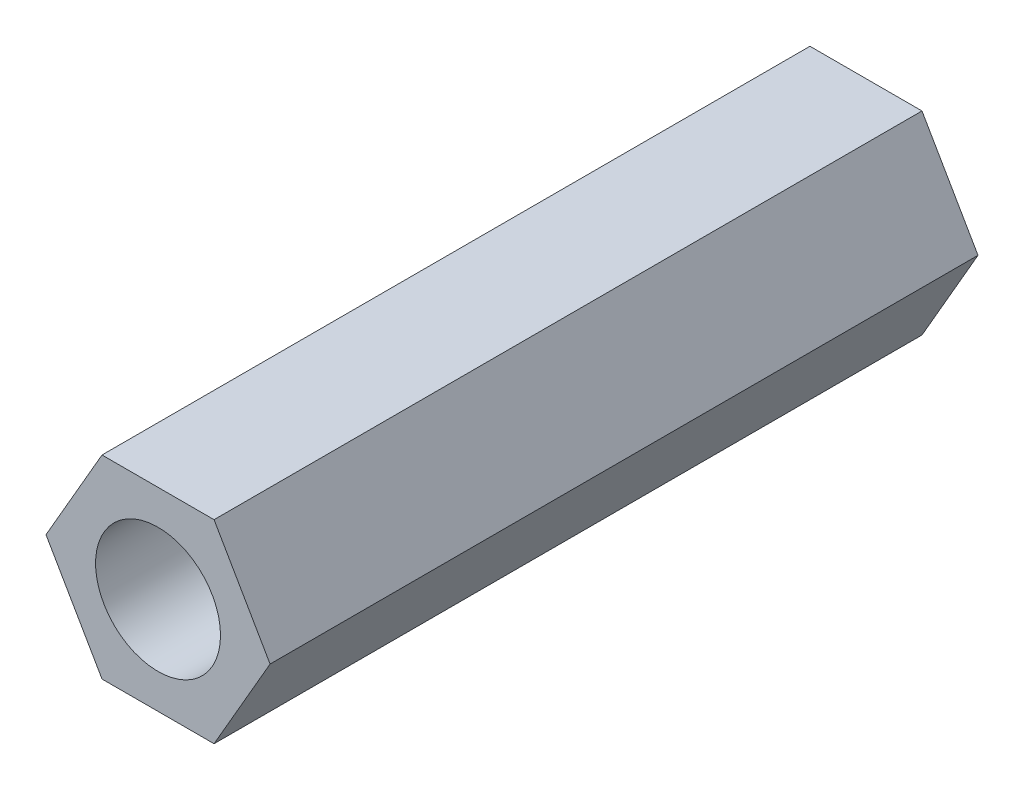
ISO-10303-21;
HEADER;
FILE_DESCRIPTION(('STEP AP214'),'2;1');
FILE_NAME('part.step','',(''),(''),'','','');
FILE_SCHEMA(('AUTOMOTIVE_DESIGN { 1 0 10303 214 1 1 1 1 }'));
ENDSEC;
DATA;
#1=APPLICATION_CONTEXT('core data for automotive mechanical design processes');
#2=APPLICATION_PROTOCOL_DEFINITION('international standard','automotive_design',2000,#1);
#3=PRODUCT_CONTEXT('',#1,'mechanical');
#4=PRODUCT('Part','Part','',(#3));
#5=PRODUCT_RELATED_PRODUCT_CATEGORY('part','',(#4));
#6=PRODUCT_DEFINITION_FORMATION('','',#4);
#7=PRODUCT_DEFINITION_CONTEXT('part definition',#1,'design');
#8=PRODUCT_DEFINITION('design','',#6,#7);
#9=PRODUCT_DEFINITION_SHAPE('','',#8);
#10=(LENGTH_UNIT() NAMED_UNIT(*) SI_UNIT(.MILLI.,.METRE.));
#11=(NAMED_UNIT(*) PLANE_ANGLE_UNIT() SI_UNIT($,.RADIAN.));
#12=(NAMED_UNIT(*) SI_UNIT($,.STERADIAN.) SOLID_ANGLE_UNIT());
#13=UNCERTAINTY_MEASURE_WITH_UNIT(LENGTH_MEASURE(1.E-05),#10,'distance_accuracy_value','');
#14=(GEOMETRIC_REPRESENTATION_CONTEXT(3) GLOBAL_UNCERTAINTY_ASSIGNED_CONTEXT((#13)) GLOBAL_UNIT_ASSIGNED_CONTEXT((#10,
#11,#12)) REPRESENTATION_CONTEXT('',''));
#15=CARTESIAN_POINT('',(0.,0.,0.));
#16=DIRECTION('',(0.,0.,1.));
#17=DIRECTION('',(1.,0.,0.));
#18=AXIS2_PLACEMENT_3D('',#15,#16,#17);
#19=CARTESIAN_POINT('',(1.34522612721186,-2.32999999999999,17.));
#20=DIRECTION('',(-0.866025403784442,0.499999999999995,0.));
#21=DIRECTION('',(-0.499999999999995,-0.866025403784441,0.));
#22=AXIS2_PLACEMENT_3D('',#19,#20,#21);
#23=PLANE('',#22);
#24=DIRECTION('',(0.499999999999995,0.866025403784441,0.));
#25=VECTOR('',#24,1.);
#26=CARTESIAN_POINT('',(1.34522612721186,-2.32999999999999,0.));
#27=LINE('',#26,#25);
#28=CARTESIAN_POINT('',(1.34522612721186,-2.32999999999999,0.));
#29=VERTEX_POINT('',#28);
#30=CARTESIAN_POINT('',(2.69045225442366,0.,0.));
#31=VERTEX_POINT('',#30);
#32=EDGE_CURVE('E117',#29,#31,#27,.T.);
#33=ORIENTED_EDGE('',*,*,#32,.T.);
#34=DIRECTION('',(0.,0.,-1.));
#35=VECTOR('',#34,1.);
#36=CARTESIAN_POINT('',(2.69045225442366,0.,17.));
#37=LINE('',#36,#35);
#38=CARTESIAN_POINT('',(2.69045225442366,0.,17.));
#39=VERTEX_POINT('',#38);
#40=EDGE_CURVE('E11',#39,#31,#37,.T.);
#41=ORIENTED_EDGE('',*,*,#40,.F.);
#42=DIRECTION('',(0.499999999999995,0.866025403784441,0.));
#43=VECTOR('',#42,1.);
#44=CARTESIAN_POINT('',(1.34522612721186,-2.32999999999999,17.));
#45=LINE('',#44,#43);
#46=CARTESIAN_POINT('',(1.34522612721186,-2.32999999999999,17.));
#47=VERTEX_POINT('',#46);
#48=EDGE_CURVE('E128',#47,#39,#45,.T.);
#49=ORIENTED_EDGE('',*,*,#48,.F.);
#50=DIRECTION('',(0.,0.,-1.));
#51=VECTOR('',#50,1.);
#52=CARTESIAN_POINT('',(1.34522612721186,-2.32999999999999,17.));
#53=LINE('',#52,#51);
#54=EDGE_CURVE('E113',#47,#29,#53,.T.);
#55=ORIENTED_EDGE('',*,*,#54,.T.);
#56=EDGE_LOOP('',(#33,#41,#49,#55));
#57=FACE_BOUND('',#56,.T.);
#58=ADVANCED_FACE('F33',(#57),#23,.F.);
#59=CARTESIAN_POINT('',(2.69045225442366,0.,17.));
#60=DIRECTION('',(-0.866025403784438,-0.500000000000001,0.));
#61=DIRECTION('',(0.500000000000001,-0.866025403784438,0.));
#62=AXIS2_PLACEMENT_3D('',#59,#60,#61);
#63=PLANE('',#62);
#64=DIRECTION('',(-0.500000000000001,0.866025403784438,0.));
#65=VECTOR('',#64,1.);
#66=CARTESIAN_POINT('',(2.69045225442366,0.,0.));
#67=LINE('',#66,#65);
#68=CARTESIAN_POINT('',(1.34522612721182,2.33000000000001,0.));
#69=VERTEX_POINT('',#68);
#70=EDGE_CURVE('E120',#31,#69,#67,.T.);
#71=ORIENTED_EDGE('',*,*,#70,.T.);
#72=DIRECTION('',(0.,0.,-1.));
#73=VECTOR('',#72,1.);
#74=CARTESIAN_POINT('',(1.34522612721182,2.33000000000001,17.));
#75=LINE('',#74,#73);
#76=CARTESIAN_POINT('',(1.34522612721182,2.33000000000001,17.));
#77=VERTEX_POINT('',#76);
#78=EDGE_CURVE('E41',#77,#69,#75,.T.);
#79=ORIENTED_EDGE('',*,*,#78,.F.);
#80=DIRECTION('',(-0.500000000000001,0.866025403784438,0.));
#81=VECTOR('',#80,1.);
#82=CARTESIAN_POINT('',(2.69045225442366,0.,17.));
#83=LINE('',#82,#81);
#84=EDGE_CURVE('E86',#39,#77,#83,.T.);
#85=ORIENTED_EDGE('',*,*,#84,.F.);
#86=ORIENTED_EDGE('',*,*,#40,.T.);
#87=EDGE_LOOP('',(#71,#79,#85,#86));
#88=FACE_BOUND('',#87,.T.);
#89=ADVANCED_FACE('F153',(#88),#63,.F.);
#90=CARTESIAN_POINT('',(1.34522612721182,2.33000000000001,17.));
#91=DIRECTION('',(0.,-1.,0.));
#92=DIRECTION('',(1.,0.,0.));
#93=AXIS2_PLACEMENT_3D('',#90,#91,#92);
#94=PLANE('',#93);
#95=DIRECTION('',(-1.,0.,0.));
#96=VECTOR('',#95,1.);
#97=CARTESIAN_POINT('',(1.34522612721182,2.33000000000001,0.));
#98=LINE('',#97,#96);
#99=CARTESIAN_POINT('',(-1.34522612721184,2.33,0.));
#100=VERTEX_POINT('',#99);
#101=EDGE_CURVE('E123',#69,#100,#98,.T.);
#102=ORIENTED_EDGE('',*,*,#101,.T.);
#103=DIRECTION('',(0.,0.,-1.));
#104=VECTOR('',#103,1.);
#105=CARTESIAN_POINT('',(-1.34522612721184,2.33,17.));
#106=LINE('',#105,#104);
#107=CARTESIAN_POINT('',(-1.34522612721184,2.33,17.));
#108=VERTEX_POINT('',#107);
#109=EDGE_CURVE('E108',#108,#100,#106,.T.);
#110=ORIENTED_EDGE('',*,*,#109,.F.);
#111=DIRECTION('',(-1.,0.,0.));
#112=VECTOR('',#111,1.);
#113=CARTESIAN_POINT('',(1.34522612721182,2.33000000000001,17.));
#114=LINE('',#113,#112);
#115=EDGE_CURVE('E99',#77,#108,#114,.T.);
#116=ORIENTED_EDGE('',*,*,#115,.F.);
#117=ORIENTED_EDGE('',*,*,#78,.T.);
#118=EDGE_LOOP('',(#102,#110,#116,#117));
#119=FACE_BOUND('',#118,.T.);
#120=ADVANCED_FACE('F134',(#119),#94,.F.);
#121=CARTESIAN_POINT('',(-1.34522612721184,2.33,17.));
#122=DIRECTION('',(0.866025403784442,-0.499999999999995,0.));
#123=DIRECTION('',(0.499999999999995,0.866025403784442,0.));
#124=AXIS2_PLACEMENT_3D('',#121,#122,#123);
#125=PLANE('',#124);
#126=DIRECTION('',(-0.499999999999995,-0.866025403784442,0.));
#127=VECTOR('',#126,1.);
#128=CARTESIAN_POINT('',(-1.34522612721184,2.33,0.));
#129=LINE('',#128,#127);
#130=CARTESIAN_POINT('',(-2.69045225442366,0.,0.));
#131=VERTEX_POINT('',#130);
#132=EDGE_CURVE('E107',#100,#131,#129,.T.);
#133=ORIENTED_EDGE('',*,*,#132,.T.);
#134=DIRECTION('',(0.,0.,-1.));
#135=VECTOR('',#134,1.);
#136=CARTESIAN_POINT('',(-2.69045225442366,0.,17.));
#137=LINE('',#136,#135);
#138=CARTESIAN_POINT('',(-2.69045225442366,0.,17.));
#139=VERTEX_POINT('',#138);
#140=EDGE_CURVE('E104',#139,#131,#137,.T.);
#141=ORIENTED_EDGE('',*,*,#140,.F.);
#142=DIRECTION('',(-0.499999999999995,-0.866025403784442,0.));
#143=VECTOR('',#142,1.);
#144=CARTESIAN_POINT('',(-1.34522612721184,2.33,17.));
#145=LINE('',#144,#143);
#146=EDGE_CURVE('E93',#108,#139,#145,.T.);
#147=ORIENTED_EDGE('',*,*,#146,.F.);
#148=ORIENTED_EDGE('',*,*,#109,.T.);
#149=EDGE_LOOP('',(#133,#141,#147,#148));
#150=FACE_BOUND('',#149,.T.);
#151=ADVANCED_FACE('F105',(#150),#125,.F.);
#152=CARTESIAN_POINT('',(-2.69045225442366,0.,17.));
#153=DIRECTION('',(0.866025403784435,0.500000000000007,0.));
#154=DIRECTION('',(-0.500000000000007,0.866025403784434,0.));
#155=AXIS2_PLACEMENT_3D('',#152,#153,#154);
#156=PLANE('',#155);
#157=DIRECTION('',(0.500000000000007,-0.866025403784434,0.));
#158=VECTOR('',#157,1.);
#159=CARTESIAN_POINT('',(-2.69045225442366,0.,0.));
#160=LINE('',#159,#158);
#161=CARTESIAN_POINT('',(-1.34522612721181,-2.33000000000001,0.));
#162=VERTEX_POINT('',#161);
#163=EDGE_CURVE('E72',#131,#162,#160,.T.);
#164=ORIENTED_EDGE('',*,*,#163,.T.);
#165=DIRECTION('',(0.,0.,-1.));
#166=VECTOR('',#165,1.);
#167=CARTESIAN_POINT('',(-1.34522612721181,-2.33000000000001,17.));
#168=LINE('',#167,#166);
#169=CARTESIAN_POINT('',(-1.34522612721181,-2.33000000000001,17.));
#170=VERTEX_POINT('',#169);
#171=EDGE_CURVE('E109',#170,#162,#168,.T.);
#172=ORIENTED_EDGE('',*,*,#171,.F.);
#173=DIRECTION('',(0.500000000000007,-0.866025403784434,0.));
#174=VECTOR('',#173,1.);
#175=CARTESIAN_POINT('',(-2.69045225442366,0.,17.));
#176=LINE('',#175,#174);
#177=EDGE_CURVE('E97',#139,#170,#176,.T.);
#178=ORIENTED_EDGE('',*,*,#177,.F.);
#179=ORIENTED_EDGE('',*,*,#140,.T.);
#180=EDGE_LOOP('',(#164,#172,#178,#179));
#181=FACE_BOUND('',#180,.T.);
#182=ADVANCED_FACE('F111',(#181),#156,.F.);
#183=CARTESIAN_POINT('',(-1.34522612721181,-2.33000000000001,17.));
#184=DIRECTION('',(0.,1.,0.));
#185=DIRECTION('',(-1.,0.,0.));
#186=AXIS2_PLACEMENT_3D('',#183,#184,#185);
#187=PLANE('',#186);
#188=DIRECTION('',(1.,0.,0.));
#189=VECTOR('',#188,1.);
#190=CARTESIAN_POINT('',(-1.34522612721181,-2.33000000000001,0.));
#191=LINE('',#190,#189);
#192=EDGE_CURVE('E78',#162,#29,#191,.T.);
#193=ORIENTED_EDGE('',*,*,#192,.T.);
#194=ORIENTED_EDGE('',*,*,#54,.F.);
#195=DIRECTION('',(1.,0.,0.));
#196=VECTOR('',#195,1.);
#197=CARTESIAN_POINT('',(-1.34522612721181,-2.33000000000001,17.));
#198=LINE('',#197,#196);
#199=EDGE_CURVE('E49',#170,#47,#198,.T.);
#200=ORIENTED_EDGE('',*,*,#199,.F.);
#201=ORIENTED_EDGE('',*,*,#171,.T.);
#202=EDGE_LOOP('',(#193,#194,#200,#201));
#203=FACE_BOUND('',#202,.T.);
#204=ADVANCED_FACE('F141',(#203),#187,.F.);
#205=CARTESIAN_POINT('',(0.,0.,17.));
#206=DIRECTION('',(0.,0.,1.));
#207=DIRECTION('',(1.,0.,0.));
#208=AXIS2_PLACEMENT_3D('',#205,#206,#207);
#209=PLANE('',#208);
#210=CARTESIAN_POINT('',(0.,0.,17.));
#211=DIRECTION('',(0.,0.,1.));
#212=DIRECTION('',(1.,0.,0.));
#213=AXIS2_PLACEMENT_3D('',#210,#211,#212);
#214=CIRCLE('',#213,1.5);
#215=CARTESIAN_POINT('',(1.5,0.,17.));
#216=VERTEX_POINT('',#215);
#217=EDGE_CURVE('E208',#216,#216,#214,.T.);
#218=ORIENTED_EDGE('',*,*,#217,.F.);
#219=EDGE_LOOP('',(#218));
#220=FACE_BOUND('',#219,.T.);
#221=ORIENTED_EDGE('',*,*,#48,.T.);
#222=ORIENTED_EDGE('',*,*,#84,.T.);
#223=ORIENTED_EDGE('',*,*,#115,.T.);
#224=ORIENTED_EDGE('',*,*,#146,.T.);
#225=ORIENTED_EDGE('',*,*,#177,.T.);
#226=ORIENTED_EDGE('',*,*,#199,.T.);
#227=EDGE_LOOP('',(#221,#222,#223,#224,#225,#226));
#228=FACE_BOUND('',#227,.T.);
#229=ADVANCED_FACE('F95',(#220,#228),#209,.T.);
#230=CARTESIAN_POINT('',(0.,0.,0.));
#231=DIRECTION('',(0.,0.,1.));
#232=DIRECTION('',(1.,0.,0.));
#233=AXIS2_PLACEMENT_3D('',#230,#231,#232);
#234=PLANE('',#233);
#235=CARTESIAN_POINT('',(0.,0.,0.));
#236=DIRECTION('',(0.,0.,1.));
#237=DIRECTION('',(1.,0.,0.));
#238=AXIS2_PLACEMENT_3D('',#235,#236,#237);
#239=CIRCLE('',#238,1.5);
#240=CARTESIAN_POINT('',(1.5,0.,0.));
#241=VERTEX_POINT('',#240);
#242=EDGE_CURVE('E121',#241,#241,#239,.T.);
#243=ORIENTED_EDGE('',*,*,#242,.T.);
#244=EDGE_LOOP('',(#243));
#245=FACE_BOUND('',#244,.T.);
#246=ORIENTED_EDGE('',*,*,#32,.F.);
#247=ORIENTED_EDGE('',*,*,#192,.F.);
#248=ORIENTED_EDGE('',*,*,#163,.F.);
#249=ORIENTED_EDGE('',*,*,#132,.F.);
#250=ORIENTED_EDGE('',*,*,#101,.F.);
#251=ORIENTED_EDGE('',*,*,#70,.F.);
#252=EDGE_LOOP('',(#246,#247,#248,#249,#250,#251));
#253=FACE_BOUND('',#252,.T.);
#254=ADVANCED_FACE('F137',(#245,#253),#234,.F.);
#255=CARTESIAN_POINT('',(0.,0.,0.));
#256=DIRECTION('',(0.,0.,1.));
#257=DIRECTION('',(1.,0.,0.));
#258=AXIS2_PLACEMENT_3D('',#255,#256,#257);
#259=CYLINDRICAL_SURFACE('',#258,1.5);
#260=ORIENTED_EDGE('',*,*,#242,.F.);
#261=EDGE_LOOP('',(#260));
#262=FACE_BOUND('',#261,.T.);
#263=ORIENTED_EDGE('',*,*,#217,.T.);
#264=EDGE_LOOP('',(#263));
#265=FACE_BOUND('',#264,.T.);
#266=ADVANCED_FACE('F190',(#262,#265),#259,.F.);
#267=CLOSED_SHELL('',(#58,#89,#120,#151,#182,#204,#229,#254,#266));
#268=MANIFOLD_SOLID_BREP('B2',#267);
#269=ADVANCED_BREP_SHAPE_REPRESENTATION('',(#18,#268),#14);
#270=SHAPE_DEFINITION_REPRESENTATION(#9,#269);
ENDSEC;
END-ISO-10303-21;
